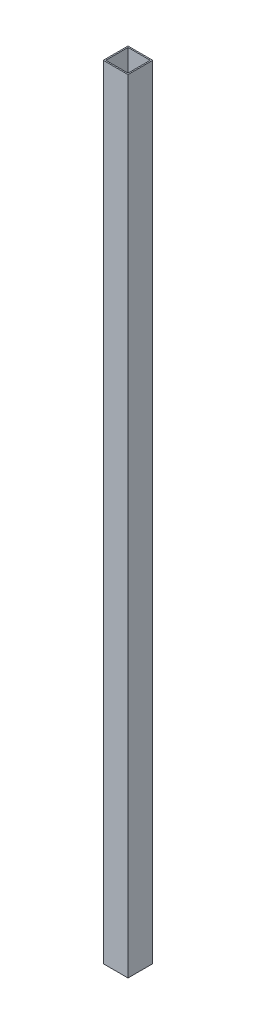
ISO-10303-21;
HEADER;
FILE_DESCRIPTION(('STEP AP214'),'2;1');
FILE_NAME('part.step','',(''),(''),'','','');
FILE_SCHEMA(('AUTOMOTIVE_DESIGN { 1 0 10303 214 1 1 1 1 }'));
ENDSEC;
DATA;
#1=APPLICATION_CONTEXT('core data for automotive mechanical design processes');
#2=APPLICATION_PROTOCOL_DEFINITION('international standard','automotive_design',2000,#1);
#3=PRODUCT_CONTEXT('',#1,'mechanical');
#4=PRODUCT('Part','Part','',(#3));
#5=PRODUCT_RELATED_PRODUCT_CATEGORY('part','',(#4));
#6=PRODUCT_DEFINITION_FORMATION('','',#4);
#7=PRODUCT_DEFINITION_CONTEXT('part definition',#1,'design');
#8=PRODUCT_DEFINITION('design','',#6,#7);
#9=PRODUCT_DEFINITION_SHAPE('','',#8);
#10=(LENGTH_UNIT() NAMED_UNIT(*) SI_UNIT(.MILLI.,.METRE.));
#11=(NAMED_UNIT(*) PLANE_ANGLE_UNIT() SI_UNIT($,.RADIAN.));
#12=(NAMED_UNIT(*) SI_UNIT($,.STERADIAN.) SOLID_ANGLE_UNIT());
#13=UNCERTAINTY_MEASURE_WITH_UNIT(LENGTH_MEASURE(1.E-05),#10,'distance_accuracy_value','');
#14=(GEOMETRIC_REPRESENTATION_CONTEXT(3) GLOBAL_UNCERTAINTY_ASSIGNED_CONTEXT((#13)) GLOBAL_UNIT_ASSIGNED_CONTEXT((#10,
#11,#12)) REPRESENTATION_CONTEXT('',''));
#15=CARTESIAN_POINT('',(0.,0.,0.));
#16=DIRECTION('',(0.,0.,1.));
#17=DIRECTION('',(1.,0.,0.));
#18=AXIS2_PLACEMENT_3D('',#15,#16,#17);
#19=CARTESIAN_POINT('',(0.,803.275,0.));
#20=DIRECTION('',(1.,0.,0.));
#21=DIRECTION('',(0.,0.,-1.));
#22=AXIS2_PLACEMENT_3D('',#19,#20,#21);
#23=PLANE('',#22);
#24=DIRECTION('',(0.,0.,1.));
#25=VECTOR('',#24,1.);
#26=CARTESIAN_POINT('',(0.,0.,0.));
#27=LINE('',#26,#25);
#28=CARTESIAN_POINT('',(0.,0.,-25.4));
#29=VERTEX_POINT('',#28);
#30=CARTESIAN_POINT('',(0.,0.,0.));
#31=VERTEX_POINT('',#30);
#32=EDGE_CURVE('E136',#29,#31,#27,.T.);
#33=ORIENTED_EDGE('',*,*,#32,.T.);
#34=DIRECTION('',(0.,-1.,0.));
#35=VECTOR('',#34,1.);
#36=CARTESIAN_POINT('',(0.,803.275,0.));
#37=LINE('',#36,#35);
#38=CARTESIAN_POINT('',(0.,803.275,0.));
#39=VERTEX_POINT('',#38);
#40=EDGE_CURVE('E11',#39,#31,#37,.T.);
#41=ORIENTED_EDGE('',*,*,#40,.F.);
#42=DIRECTION('',(0.,0.,1.));
#43=VECTOR('',#42,1.);
#44=CARTESIAN_POINT('',(0.,803.275,0.));
#45=LINE('',#44,#43);
#46=CARTESIAN_POINT('',(0.,803.275,-25.4));
#47=VERTEX_POINT('',#46);
#48=EDGE_CURVE('E140',#47,#39,#45,.T.);
#49=ORIENTED_EDGE('',*,*,#48,.F.);
#50=DIRECTION('',(0.,-1.,0.));
#51=VECTOR('',#50,1.);
#52=CARTESIAN_POINT('',(0.,803.275,-25.4));
#53=LINE('',#52,#51);
#54=EDGE_CURVE('E150',#47,#29,#53,.T.);
#55=ORIENTED_EDGE('',*,*,#54,.T.);
#56=EDGE_LOOP('',(#33,#41,#49,#55));
#57=FACE_BOUND('',#56,.T.);
#58=ADVANCED_FACE('F39',(#57),#23,.F.);
#59=CARTESIAN_POINT('',(0.,803.275,0.));
#60=DIRECTION('',(0.,0.,-1.));
#61=DIRECTION('',(-1.,0.,0.));
#62=AXIS2_PLACEMENT_3D('',#59,#60,#61);
#63=PLANE('',#62);
#64=DIRECTION('',(1.,0.,0.));
#65=VECTOR('',#64,1.);
#66=CARTESIAN_POINT('',(0.,0.,0.));
#67=LINE('',#66,#65);
#68=CARTESIAN_POINT('',(25.4,0.,0.));
#69=VERTEX_POINT('',#68);
#70=EDGE_CURVE('E153',#31,#69,#67,.T.);
#71=ORIENTED_EDGE('',*,*,#70,.T.);
#72=DIRECTION('',(0.,-1.,0.));
#73=VECTOR('',#72,1.);
#74=CARTESIAN_POINT('',(25.4,803.275,0.));
#75=LINE('',#74,#73);
#76=CARTESIAN_POINT('',(25.4,803.275,0.));
#77=VERTEX_POINT('',#76);
#78=EDGE_CURVE('E46',#77,#69,#75,.T.);
#79=ORIENTED_EDGE('',*,*,#78,.F.);
#80=DIRECTION('',(1.,0.,0.));
#81=VECTOR('',#80,1.);
#82=CARTESIAN_POINT('',(0.,803.275,0.));
#83=LINE('',#82,#81);
#84=EDGE_CURVE('E143',#39,#77,#83,.T.);
#85=ORIENTED_EDGE('',*,*,#84,.F.);
#86=ORIENTED_EDGE('',*,*,#40,.T.);
#87=EDGE_LOOP('',(#71,#79,#85,#86));
#88=FACE_BOUND('',#87,.T.);
#89=ADVANCED_FACE('F181',(#88),#63,.F.);
#90=CARTESIAN_POINT('',(25.4,803.275,0.));
#91=DIRECTION('',(-1.,0.,0.));
#92=DIRECTION('',(0.,0.,1.));
#93=AXIS2_PLACEMENT_3D('',#90,#91,#92);
#94=PLANE('',#93);
#95=DIRECTION('',(0.,0.,-1.));
#96=VECTOR('',#95,1.);
#97=CARTESIAN_POINT('',(25.4,0.,0.));
#98=LINE('',#97,#96);
#99=CARTESIAN_POINT('',(25.4,0.,-25.4));
#100=VERTEX_POINT('',#99);
#101=EDGE_CURVE('E155',#69,#100,#98,.T.);
#102=ORIENTED_EDGE('',*,*,#101,.T.);
#103=DIRECTION('',(0.,-1.,0.));
#104=VECTOR('',#103,1.);
#105=CARTESIAN_POINT('',(25.4,803.275,-25.4));
#106=LINE('',#105,#104);
#107=CARTESIAN_POINT('',(25.4,803.275,-25.4));
#108=VERTEX_POINT('',#107);
#109=EDGE_CURVE('E160',#108,#100,#106,.T.);
#110=ORIENTED_EDGE('',*,*,#109,.F.);
#111=DIRECTION('',(0.,0.,-1.));
#112=VECTOR('',#111,1.);
#113=CARTESIAN_POINT('',(25.4,803.275,0.));
#114=LINE('',#113,#112);
#115=EDGE_CURVE('E146',#77,#108,#114,.T.);
#116=ORIENTED_EDGE('',*,*,#115,.F.);
#117=ORIENTED_EDGE('',*,*,#78,.T.);
#118=EDGE_LOOP('',(#102,#110,#116,#117));
#119=FACE_BOUND('',#118,.T.);
#120=ADVANCED_FACE('F167',(#119),#94,.F.);
#121=CARTESIAN_POINT('',(0.,803.275,-25.4));
#122=DIRECTION('',(0.,0.,1.));
#123=DIRECTION('',(1.,0.,0.));
#124=AXIS2_PLACEMENT_3D('',#121,#122,#123);
#125=PLANE('',#124);
#126=DIRECTION('',(-1.,0.,0.));
#127=VECTOR('',#126,1.);
#128=CARTESIAN_POINT('',(0.,0.,-25.4));
#129=LINE('',#128,#127);
#130=EDGE_CURVE('E144',#100,#29,#129,.T.);
#131=ORIENTED_EDGE('',*,*,#130,.T.);
#132=ORIENTED_EDGE('',*,*,#54,.F.);
#133=DIRECTION('',(-1.,0.,0.));
#134=VECTOR('',#133,1.);
#135=CARTESIAN_POINT('',(0.,803.275,-25.4));
#136=LINE('',#135,#134);
#137=EDGE_CURVE('E148',#108,#47,#136,.T.);
#138=ORIENTED_EDGE('',*,*,#137,.F.);
#139=ORIENTED_EDGE('',*,*,#109,.T.);
#140=EDGE_LOOP('',(#131,#132,#138,#139));
#141=FACE_BOUND('',#140,.T.);
#142=ADVANCED_FACE('F174',(#141),#125,.F.);
#143=CARTESIAN_POINT('',(0.,803.275,0.));
#144=DIRECTION('',(0.,-1.,0.));
#145=DIRECTION('',(0.,0.,-1.));
#146=AXIS2_PLACEMENT_3D('',#143,#144,#145);
#147=PLANE('',#146);
#148=DIRECTION('',(-1.,0.,0.));
#149=VECTOR('',#148,1.);
#150=CARTESIAN_POINT('',(24.13,803.275,-24.13));
#151=LINE('',#150,#149);
#152=CARTESIAN_POINT('',(24.13,803.275,-24.13));
#153=VERTEX_POINT('',#152);
#154=CARTESIAN_POINT('',(1.27,803.275,-24.13));
#155=VERTEX_POINT('',#154);
#156=EDGE_CURVE('E130',#153,#155,#151,.T.);
#157=ORIENTED_EDGE('',*,*,#156,.F.);
#158=DIRECTION('',(0.,0.,-1.));
#159=VECTOR('',#158,1.);
#160=CARTESIAN_POINT('',(24.13,803.275,-24.13));
#161=LINE('',#160,#159);
#162=CARTESIAN_POINT('',(24.13,803.275,-1.27));
#163=VERTEX_POINT('',#162);
#164=EDGE_CURVE('E53',#163,#153,#161,.T.);
#165=ORIENTED_EDGE('',*,*,#164,.F.);
#166=DIRECTION('',(1.,0.,0.));
#167=VECTOR('',#166,1.);
#168=CARTESIAN_POINT('',(24.13,803.275,-1.27));
#169=LINE('',#168,#167);
#170=CARTESIAN_POINT('',(1.27,803.275,-1.27));
#171=VERTEX_POINT('',#170);
#172=EDGE_CURVE('E121',#171,#163,#169,.T.);
#173=ORIENTED_EDGE('',*,*,#172,.F.);
#174=DIRECTION('',(0.,0.,1.));
#175=VECTOR('',#174,1.);
#176=CARTESIAN_POINT('',(1.27,803.275,-24.13));
#177=LINE('',#176,#175);
#178=EDGE_CURVE('E124',#155,#171,#177,.T.);
#179=ORIENTED_EDGE('',*,*,#178,.F.);
#180=EDGE_LOOP('',(#157,#165,#173,#179));
#181=FACE_BOUND('',#180,.T.);
#182=ORIENTED_EDGE('',*,*,#48,.T.);
#183=ORIENTED_EDGE('',*,*,#84,.T.);
#184=ORIENTED_EDGE('',*,*,#115,.T.);
#185=ORIENTED_EDGE('',*,*,#137,.T.);
#186=EDGE_LOOP('',(#182,#183,#184,#185));
#187=FACE_BOUND('',#186,.T.);
#188=ADVANCED_FACE('F180',(#181,#187),#147,.F.);
#189=CARTESIAN_POINT('',(0.,0.,0.));
#190=DIRECTION('',(0.,-1.,0.));
#191=DIRECTION('',(0.,0.,-1.));
#192=AXIS2_PLACEMENT_3D('',#189,#190,#191);
#193=PLANE('',#192);
#194=DIRECTION('',(0.,0.,-1.));
#195=VECTOR('',#194,1.);
#196=CARTESIAN_POINT('',(24.13,0.,-24.13));
#197=LINE('',#196,#195);
#198=CARTESIAN_POINT('',(24.13,0.,-1.27));
#199=VERTEX_POINT('',#198);
#200=CARTESIAN_POINT('',(24.13,0.,-24.13));
#201=VERTEX_POINT('',#200);
#202=EDGE_CURVE('E105',#199,#201,#197,.T.);
#203=ORIENTED_EDGE('',*,*,#202,.T.);
#204=DIRECTION('',(-1.,0.,0.));
#205=VECTOR('',#204,1.);
#206=CARTESIAN_POINT('',(24.13,0.,-24.13));
#207=LINE('',#206,#205);
#208=CARTESIAN_POINT('',(1.27,0.,-24.13));
#209=VERTEX_POINT('',#208);
#210=EDGE_CURVE('E114',#201,#209,#207,.T.);
#211=ORIENTED_EDGE('',*,*,#210,.T.);
#212=DIRECTION('',(0.,0.,1.));
#213=VECTOR('',#212,1.);
#214=CARTESIAN_POINT('',(1.27,0.,-24.13));
#215=LINE('',#214,#213);
#216=CARTESIAN_POINT('',(1.27,0.,-1.27));
#217=VERTEX_POINT('',#216);
#218=EDGE_CURVE('E61',#209,#217,#215,.T.);
#219=ORIENTED_EDGE('',*,*,#218,.T.);
#220=DIRECTION('',(1.,0.,0.));
#221=VECTOR('',#220,1.);
#222=CARTESIAN_POINT('',(24.13,0.,-1.27));
#223=LINE('',#222,#221);
#224=EDGE_CURVE('E111',#217,#199,#223,.T.);
#225=ORIENTED_EDGE('',*,*,#224,.T.);
#226=EDGE_LOOP('',(#203,#211,#219,#225));
#227=FACE_BOUND('',#226,.T.);
#228=ORIENTED_EDGE('',*,*,#32,.F.);
#229=ORIENTED_EDGE('',*,*,#130,.F.);
#230=ORIENTED_EDGE('',*,*,#101,.F.);
#231=ORIENTED_EDGE('',*,*,#70,.F.);
#232=EDGE_LOOP('',(#228,#229,#230,#231));
#233=FACE_BOUND('',#232,.T.);
#234=ADVANCED_FACE('F118',(#227,#233),#193,.T.);
#235=CARTESIAN_POINT('',(24.13,0.,-24.13));
#236=DIRECTION('',(1.,0.,0.));
#237=DIRECTION('',(0.,0.,-1.));
#238=AXIS2_PLACEMENT_3D('',#235,#236,#237);
#239=PLANE('',#238);
#240=ORIENTED_EDGE('',*,*,#164,.T.);
#241=DIRECTION('',(0.,1.,0.));
#242=VECTOR('',#241,1.);
#243=CARTESIAN_POINT('',(24.13,0.,-24.13));
#244=LINE('',#243,#242);
#245=EDGE_CURVE('E101',#201,#153,#244,.T.);
#246=ORIENTED_EDGE('',*,*,#245,.F.);
#247=ORIENTED_EDGE('',*,*,#202,.F.);
#248=DIRECTION('',(0.,1.,0.));
#249=VECTOR('',#248,1.);
#250=CARTESIAN_POINT('',(24.13,0.,-1.27));
#251=LINE('',#250,#249);
#252=EDGE_CURVE('E134',#199,#163,#251,.T.);
#253=ORIENTED_EDGE('',*,*,#252,.T.);
#254=EDGE_LOOP('',(#240,#246,#247,#253));
#255=FACE_BOUND('',#254,.T.);
#256=ADVANCED_FACE('F103',(#255),#239,.F.);
#257=CARTESIAN_POINT('',(24.13,0.,-1.27));
#258=DIRECTION('',(0.,0.,1.));
#259=DIRECTION('',(1.,0.,0.));
#260=AXIS2_PLACEMENT_3D('',#257,#258,#259);
#261=PLANE('',#260);
#262=ORIENTED_EDGE('',*,*,#172,.T.);
#263=ORIENTED_EDGE('',*,*,#252,.F.);
#264=ORIENTED_EDGE('',*,*,#224,.F.);
#265=DIRECTION('',(0.,1.,0.));
#266=VECTOR('',#265,1.);
#267=CARTESIAN_POINT('',(1.27,0.,-1.27));
#268=LINE('',#267,#266);
#269=EDGE_CURVE('E137',#217,#171,#268,.T.);
#270=ORIENTED_EDGE('',*,*,#269,.T.);
#271=EDGE_LOOP('',(#262,#263,#264,#270));
#272=FACE_BOUND('',#271,.T.);
#273=ADVANCED_FACE('F198',(#272),#261,.F.);
#274=CARTESIAN_POINT('',(1.27,0.,-24.13));
#275=DIRECTION('',(-1.,0.,0.));
#276=DIRECTION('',(0.,0.,1.));
#277=AXIS2_PLACEMENT_3D('',#274,#275,#276);
#278=PLANE('',#277);
#279=ORIENTED_EDGE('',*,*,#178,.T.);
#280=ORIENTED_EDGE('',*,*,#269,.F.);
#281=ORIENTED_EDGE('',*,*,#218,.F.);
#282=DIRECTION('',(0.,1.,0.));
#283=VECTOR('',#282,1.);
#284=CARTESIAN_POINT('',(1.27,0.,-24.13));
#285=LINE('',#284,#283);
#286=EDGE_CURVE('E110',#209,#155,#285,.T.);
#287=ORIENTED_EDGE('',*,*,#286,.T.);
#288=EDGE_LOOP('',(#279,#280,#281,#287));
#289=FACE_BOUND('',#288,.T.);
#290=ADVANCED_FACE('F201',(#289),#278,.F.);
#291=CARTESIAN_POINT('',(24.13,0.,-24.13));
#292=DIRECTION('',(0.,0.,-1.));
#293=DIRECTION('',(-1.,0.,0.));
#294=AXIS2_PLACEMENT_3D('',#291,#292,#293);
#295=PLANE('',#294);
#296=ORIENTED_EDGE('',*,*,#156,.T.);
#297=ORIENTED_EDGE('',*,*,#286,.F.);
#298=ORIENTED_EDGE('',*,*,#210,.F.);
#299=ORIENTED_EDGE('',*,*,#245,.T.);
#300=EDGE_LOOP('',(#296,#297,#298,#299));
#301=FACE_BOUND('',#300,.T.);
#302=ADVANCED_FACE('F115',(#301),#295,.F.);
#303=CLOSED_SHELL('',(#58,#89,#120,#142,#188,#234,#256,#273,#290,#302));
#304=MANIFOLD_SOLID_BREP('B2',#303);
#305=ADVANCED_BREP_SHAPE_REPRESENTATION('',(#18,#304),#14);
#306=SHAPE_DEFINITION_REPRESENTATION(#9,#305);
ENDSEC;
END-ISO-10303-21;
